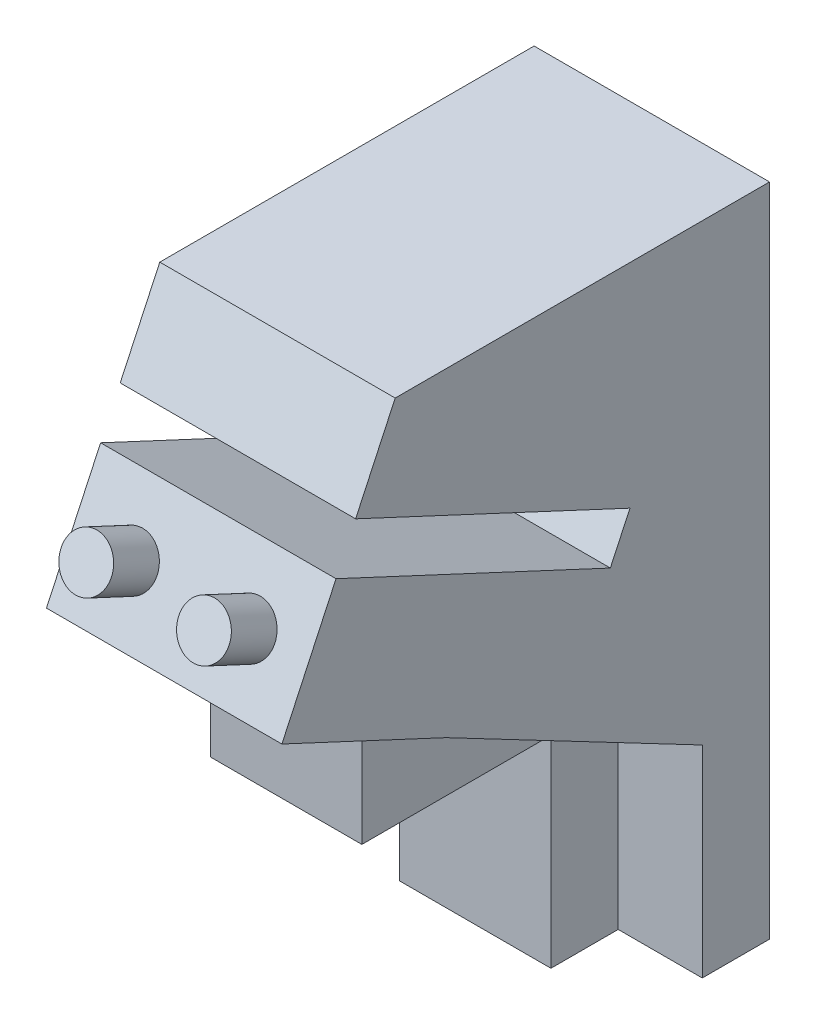
ISO-10303-21;
HEADER;
FILE_DESCRIPTION(('STEP AP214'),'2;1');
FILE_NAME('part.step','',(''),(''),'','','');
FILE_SCHEMA(('AUTOMOTIVE_DESIGN { 1 0 10303 214 1 1 1 1 }'));
ENDSEC;
DATA;
#1=APPLICATION_CONTEXT('core data for automotive mechanical design processes');
#2=APPLICATION_PROTOCOL_DEFINITION('international standard','automotive_design',2000,#1);
#3=PRODUCT_CONTEXT('',#1,'mechanical');
#4=PRODUCT('Part','Part','',(#3));
#5=PRODUCT_RELATED_PRODUCT_CATEGORY('part','',(#4));
#6=PRODUCT_DEFINITION_FORMATION('','',#4);
#7=PRODUCT_DEFINITION_CONTEXT('part definition',#1,'design');
#8=PRODUCT_DEFINITION('design','',#6,#7);
#9=PRODUCT_DEFINITION_SHAPE('','',#8);
#10=(LENGTH_UNIT() NAMED_UNIT(*) SI_UNIT(.MILLI.,.METRE.));
#11=(NAMED_UNIT(*) PLANE_ANGLE_UNIT() SI_UNIT($,.RADIAN.));
#12=(NAMED_UNIT(*) SI_UNIT($,.STERADIAN.) SOLID_ANGLE_UNIT());
#13=UNCERTAINTY_MEASURE_WITH_UNIT(LENGTH_MEASURE(1.E-05),#10,'distance_accuracy_value','');
#14=(GEOMETRIC_REPRESENTATION_CONTEXT(3) GLOBAL_UNCERTAINTY_ASSIGNED_CONTEXT((#13)) GLOBAL_UNIT_ASSIGNED_CONTEXT((#10,
#11,#12)) REPRESENTATION_CONTEXT('',''));
#15=CARTESIAN_POINT('',(0.,0.,0.));
#16=DIRECTION('',(0.,0.,1.));
#17=DIRECTION('',(1.,0.,0.));
#18=AXIS2_PLACEMENT_3D('',#15,#16,#17);
#19=CARTESIAN_POINT('',(28.,0.,0.));
#20=DIRECTION('',(0.,0.,1.));
#21=DIRECTION('',(1.,0.,0.));
#22=AXIS2_PLACEMENT_3D('',#19,#20,#21);
#23=PLANE('',#22);
#24=DIRECTION('',(0.,1.,0.));
#25=VECTOR('',#24,1.);
#26=CARTESIAN_POINT('',(0.,0.,0.));
#27=LINE('',#26,#25);
#28=CARTESIAN_POINT('',(0.,0.,0.));
#29=VERTEX_POINT('',#28);
#30=CARTESIAN_POINT('',(0.,78.,0.));
#31=VERTEX_POINT('',#30);
#32=EDGE_CURVE('E162',#29,#31,#27,.T.);
#33=ORIENTED_EDGE('',*,*,#32,.T.);
#34=DIRECTION('',(-1.,0.,0.));
#35=VECTOR('',#34,1.);
#36=CARTESIAN_POINT('',(28.,78.,0.));
#37=LINE('',#36,#35);
#38=CARTESIAN_POINT('',(28.,78.,0.));
#39=VERTEX_POINT('',#38);
#40=EDGE_CURVE('E46',#39,#31,#37,.T.);
#41=ORIENTED_EDGE('',*,*,#40,.F.);
#42=DIRECTION('',(0.,1.,0.));
#43=VECTOR('',#42,1.);
#44=CARTESIAN_POINT('',(28.,0.,0.));
#45=LINE('',#44,#43);
#46=CARTESIAN_POINT('',(28.,0.,0.));
#47=VERTEX_POINT('',#46);
#48=EDGE_CURVE('E233',#47,#39,#45,.T.);
#49=ORIENTED_EDGE('',*,*,#48,.F.);
#50=DIRECTION('',(-1.,0.,0.));
#51=VECTOR('',#50,1.);
#52=CARTESIAN_POINT('',(28.,0.,0.));
#53=LINE('',#52,#51);
#54=EDGE_CURVE('E11',#47,#29,#53,.T.);
#55=ORIENTED_EDGE('',*,*,#54,.T.);
#56=EDGE_LOOP('',(#33,#41,#49,#55));
#57=FACE_BOUND('',#56,.T.);
#58=ADVANCED_FACE('F39',(#57),#23,.F.);
#59=CARTESIAN_POINT('',(28.,78.,0.));
#60=DIRECTION('',(0.,-1.,0.));
#61=DIRECTION('',(0.,0.,-1.));
#62=AXIS2_PLACEMENT_3D('',#59,#60,#61);
#63=PLANE('',#62);
#64=DIRECTION('',(0.,0.,1.));
#65=VECTOR('',#64,1.);
#66=CARTESIAN_POINT('',(0.,78.,0.));
#67=LINE('',#66,#65);
#68=CARTESIAN_POINT('',(0.,78.,44.5234186246685));
#69=VERTEX_POINT('',#68);
#70=EDGE_CURVE('E164',#31,#69,#67,.T.);
#71=ORIENTED_EDGE('',*,*,#70,.T.);
#72=DIRECTION('',(-1.,0.,0.));
#73=VECTOR('',#72,1.);
#74=CARTESIAN_POINT('',(28.,78.,44.5234186246685));
#75=LINE('',#74,#73);
#76=CARTESIAN_POINT('',(28.,78.,44.5234186246685));
#77=VERTEX_POINT('',#76);
#78=EDGE_CURVE('E206',#77,#69,#75,.T.);
#79=ORIENTED_EDGE('',*,*,#78,.F.);
#80=DIRECTION('',(0.,0.,1.));
#81=VECTOR('',#80,1.);
#82=CARTESIAN_POINT('',(28.,78.,0.));
#83=LINE('',#82,#81);
#84=EDGE_CURVE('E215',#39,#77,#83,.T.);
#85=ORIENTED_EDGE('',*,*,#84,.F.);
#86=ORIENTED_EDGE('',*,*,#40,.T.);
#87=EDGE_LOOP('',(#71,#79,#85,#86));
#88=FACE_BOUND('',#87,.T.);
#89=ADVANCED_FACE('F213',(#88),#63,.F.);
#90=CARTESIAN_POINT('',(28.,78.,44.5234186246685));
#91=DIRECTION('',(0.,-0.422618261740703,-0.906307787036648));
#92=DIRECTION('',(0.,0.906307787036648,-0.422618261740703));
#93=AXIS2_PLACEMENT_3D('',#90,#91,#92);
#94=PLANE('',#93);
#95=DIRECTION('',(0.,-0.906307787036648,0.422618261740703));
#96=VECTOR('',#95,1.);
#97=CARTESIAN_POINT('',(0.,78.,44.5234186246685));
#98=LINE('',#97,#96);
#99=CARTESIAN_POINT('',(0.,67.9092860368489,49.2287958219375));
#100=VERTEX_POINT('',#99);
#101=EDGE_CURVE('E167',#69,#100,#98,.T.);
#102=ORIENTED_EDGE('',*,*,#101,.T.);
#103=DIRECTION('',(-1.,0.,0.));
#104=VECTOR('',#103,1.);
#105=CARTESIAN_POINT('',(28.,67.9092860368489,49.2287958219375));
#106=LINE('',#105,#104);
#107=CARTESIAN_POINT('',(28.,67.9092860368489,49.2287958219375));
#108=VERTEX_POINT('',#107);
#109=EDGE_CURVE('E203',#108,#100,#106,.T.);
#110=ORIENTED_EDGE('',*,*,#109,.F.);
#111=DIRECTION('',(0.,-0.906307787036648,0.422618261740703));
#112=VECTOR('',#111,1.);
#113=CARTESIAN_POINT('',(28.,78.,44.5234186246685));
#114=LINE('',#113,#112);
#115=EDGE_CURVE('E229',#77,#108,#114,.T.);
#116=ORIENTED_EDGE('',*,*,#115,.F.);
#117=ORIENTED_EDGE('',*,*,#78,.T.);
#118=EDGE_LOOP('',(#102,#110,#116,#117));
#119=FACE_BOUND('',#118,.T.);
#120=ADVANCED_FACE('F225',(#119),#94,.F.);
#121=CARTESIAN_POINT('',(28.,52.6950286141837,16.6017154886181));
#122=DIRECTION('',(0.,0.90630778703665,-0.4226182617407));
#123=DIRECTION('',(0.,0.4226182617407,0.90630778703665));
#124=AXIS2_PLACEMENT_3D('',#121,#122,#123);
#125=PLANE('',#124);
#126=DIRECTION('',(0.,-0.4226182617407,-0.90630778703665));
#127=VECTOR('',#126,1.);
#128=CARTESIAN_POINT('',(0.,52.6950286141837,16.6017154886181));
#129=LINE('',#128,#127);
#130=CARTESIAN_POINT('',(0.,52.6950286141837,16.6017154886181));
#131=VERTEX_POINT('',#130);
#132=EDGE_CURVE('E169',#100,#131,#129,.T.);
#133=ORIENTED_EDGE('',*,*,#132,.T.);
#134=DIRECTION('',(-1.,0.,0.));
#135=VECTOR('',#134,1.);
#136=CARTESIAN_POINT('',(28.,52.6950286141837,16.6017154886181));
#137=LINE('',#136,#135);
#138=CARTESIAN_POINT('',(28.,52.6950286141837,16.6017154886181));
#139=VERTEX_POINT('',#138);
#140=EDGE_CURVE('E151',#139,#131,#137,.T.);
#141=ORIENTED_EDGE('',*,*,#140,.F.);
#142=DIRECTION('',(0.,-0.4226182617407,-0.90630778703665));
#143=VECTOR('',#142,1.);
#144=CARTESIAN_POINT('',(28.,52.6950286141837,16.6017154886181));
#145=LINE('',#144,#143);
#146=EDGE_CURVE('E139',#108,#139,#145,.T.);
#147=ORIENTED_EDGE('',*,*,#146,.F.);
#148=ORIENTED_EDGE('',*,*,#109,.T.);
#149=EDGE_LOOP('',(#133,#141,#147,#148));
#150=FACE_BOUND('',#149,.T.);
#151=ADVANCED_FACE('F228',(#150),#125,.F.);
#152=CARTESIAN_POINT('',(28.,47.6950286141837,18.9332537793931));
#153=DIRECTION('',(0.,-0.422618261740699,-0.90630778703665));
#154=DIRECTION('',(0.,0.90630778703665,-0.422618261740699));
#155=AXIS2_PLACEMENT_3D('',#152,#153,#154);
#156=PLANE('',#155);
#157=DIRECTION('',(0.,-0.90630778703665,0.422618261740699));
#158=VECTOR('',#157,1.);
#159=CARTESIAN_POINT('',(0.,47.6950286141837,18.9332537793931));
#160=LINE('',#159,#158);
#161=CARTESIAN_POINT('',(0.,47.6950286141837,18.9332537793931));
#162=VERTEX_POINT('',#161);
#163=EDGE_CURVE('E148',#131,#162,#160,.T.);
#164=ORIENTED_EDGE('',*,*,#163,.T.);
#165=DIRECTION('',(-1.,0.,0.));
#166=VECTOR('',#165,1.);
#167=CARTESIAN_POINT('',(28.,47.6950286141837,18.9332537793931));
#168=LINE('',#167,#166);
#169=CARTESIAN_POINT('',(28.,47.6950286141837,18.9332537793931));
#170=VERTEX_POINT('',#169);
#171=EDGE_CURVE('E145',#170,#162,#168,.T.);
#172=ORIENTED_EDGE('',*,*,#171,.F.);
#173=DIRECTION('',(0.,-0.90630778703665,0.422618261740699));
#174=VECTOR('',#173,1.);
#175=CARTESIAN_POINT('',(28.,47.6950286141837,18.9332537793931));
#176=LINE('',#175,#174);
#177=EDGE_CURVE('E131',#139,#170,#176,.T.);
#178=ORIENTED_EDGE('',*,*,#177,.F.);
#179=ORIENTED_EDGE('',*,*,#140,.T.);
#180=EDGE_LOOP('',(#164,#172,#178,#179));
#181=FACE_BOUND('',#180,.T.);
#182=ADVANCED_FACE('F146',(#181),#156,.F.);
#183=CARTESIAN_POINT('',(28.,62.9092860368489,51.5603341127125));
#184=DIRECTION('',(0.,-0.90630778703665,0.4226182617407));
#185=DIRECTION('',(0.,-0.4226182617407,-0.90630778703665));
#186=AXIS2_PLACEMENT_3D('',#183,#184,#185);
#187=PLANE('',#186);
#188=DIRECTION('',(0.,0.4226182617407,0.90630778703665));
#189=VECTOR('',#188,1.);
#190=CARTESIAN_POINT('',(0.,62.9092860368489,51.5603341127125));
#191=LINE('',#190,#189);
#192=CARTESIAN_POINT('',(0.,62.9092860368489,51.5603341127125));
#193=VERTEX_POINT('',#192);
#194=EDGE_CURVE('E172',#162,#193,#191,.T.);
#195=ORIENTED_EDGE('',*,*,#194,.T.);
#196=DIRECTION('',(-1.,0.,0.));
#197=VECTOR('',#196,1.);
#198=CARTESIAN_POINT('',(28.,62.9092860368489,51.5603341127125));
#199=LINE('',#198,#197);
#200=CARTESIAN_POINT('',(28.,62.9092860368489,51.5603341127125));
#201=VERTEX_POINT('',#200);
#202=EDGE_CURVE('E152',#201,#193,#199,.T.);
#203=ORIENTED_EDGE('',*,*,#202,.F.);
#204=DIRECTION('',(0.,0.4226182617407,0.90630778703665));
#205=VECTOR('',#204,1.);
#206=CARTESIAN_POINT('',(28.,62.9092860368489,51.5603341127125));
#207=LINE('',#206,#205);
#208=EDGE_CURVE('E136',#170,#201,#207,.T.);
#209=ORIENTED_EDGE('',*,*,#208,.F.);
#210=ORIENTED_EDGE('',*,*,#171,.T.);
#211=EDGE_LOOP('',(#195,#203,#209,#210));
#212=FACE_BOUND('',#211,.T.);
#213=ADVANCED_FACE('F154',(#212),#187,.F.);
#214=CARTESIAN_POINT('',(28.,49.0993779757915,58.));
#215=DIRECTION('',(0.,-0.4226182617407,-0.90630778703665));
#216=DIRECTION('',(0.,0.90630778703665,-0.4226182617407));
#217=AXIS2_PLACEMENT_3D('',#214,#215,#216);
#218=PLANE('',#217);
#219=CARTESIAN_POINT('',(7.,55.8966863785599,54.8303630370128));
#220=DIRECTION('',(0.,-0.4226182617407,-0.90630778703665));
#221=DIRECTION('',(0.,0.90630778703665,-0.4226182617407));
#222=AXIS2_PLACEMENT_3D('',#219,#220,#221);
#223=CIRCLE('',#222,3.);
#224=CARTESIAN_POINT('',(7.,58.6156097396699,53.5625082517907));
#225=VERTEX_POINT('',#224);
#226=EDGE_CURVE('E268',#225,#225,#223,.T.);
#227=ORIENTED_EDGE('',*,*,#226,.T.);
#228=EDGE_LOOP('',(#227));
#229=FACE_BOUND('',#228,.T.);
#230=CARTESIAN_POINT('',(21.,55.8966863785599,54.8303630370128));
#231=DIRECTION('',(0.,-0.4226182617407,-0.90630778703665));
#232=DIRECTION('',(0.,0.90630778703665,-0.4226182617407));
#233=AXIS2_PLACEMENT_3D('',#230,#231,#232);
#234=CIRCLE('',#233,3.00000000000001);
#235=CARTESIAN_POINT('',(21.,58.6156097396699,53.5625082517907));
#236=VERTEX_POINT('',#235);
#237=EDGE_CURVE('E265',#236,#236,#234,.T.);
#238=ORIENTED_EDGE('',*,*,#237,.T.);
#239=EDGE_LOOP('',(#238));
#240=FACE_BOUND('',#239,.T.);
#241=DIRECTION('',(0.,-0.90630778703665,0.4226182617407));
#242=VECTOR('',#241,1.);
#243=CARTESIAN_POINT('',(0.,49.0993779757915,58.));
#244=LINE('',#243,#242);
#245=CARTESIAN_POINT('',(0.,49.0993779757915,58.));
#246=VERTEX_POINT('',#245);
#247=EDGE_CURVE('E174',#193,#246,#244,.T.);
#248=ORIENTED_EDGE('',*,*,#247,.T.);
#249=DIRECTION('',(-1.,0.,0.));
#250=VECTOR('',#249,1.);
#251=CARTESIAN_POINT('',(28.,49.0993779757915,58.));
#252=LINE('',#251,#250);
#253=CARTESIAN_POINT('',(28.,49.0993779757915,58.));
#254=VERTEX_POINT('',#253);
#255=EDGE_CURVE('E198',#254,#246,#252,.T.);
#256=ORIENTED_EDGE('',*,*,#255,.F.);
#257=DIRECTION('',(0.,-0.90630778703665,0.4226182617407));
#258=VECTOR('',#257,1.);
#259=CARTESIAN_POINT('',(28.,49.0993779757915,58.));
#260=LINE('',#259,#258);
#261=EDGE_CURVE('E62',#201,#254,#260,.T.);
#262=ORIENTED_EDGE('',*,*,#261,.F.);
#263=ORIENTED_EDGE('',*,*,#202,.T.);
#264=EDGE_LOOP('',(#248,#256,#262,#263));
#265=FACE_BOUND('',#264,.T.);
#266=ADVANCED_FACE('F318',(#229,#240,#265),#218,.F.);
#267=CARTESIAN_POINT('',(28.,40.,38.4863209585827));
#268=DIRECTION('',(0.,0.906307787036651,-0.422618261740697));
#269=DIRECTION('',(0.,0.422618261740697,0.906307787036651));
#270=AXIS2_PLACEMENT_3D('',#267,#268,#269);
#271=PLANE('',#270);
#272=DIRECTION('',(0.,-0.422618261740697,-0.906307787036651));
#273=VECTOR('',#272,1.);
#274=CARTESIAN_POINT('',(0.,40.,38.4863209585827));
#275=LINE('',#274,#273);
#276=CARTESIAN_POINT('',(0.,40.,38.4863209585827));
#277=VERTEX_POINT('',#276);
#278=EDGE_CURVE('E176',#246,#277,#275,.T.);
#279=ORIENTED_EDGE('',*,*,#278,.T.);
#280=DIRECTION('',(-1.,0.,0.));
#281=VECTOR('',#280,1.);
#282=CARTESIAN_POINT('',(28.,40.,38.4863209585827));
#283=LINE('',#282,#281);
#284=CARTESIAN_POINT('',(18.,40.,38.4863209585827));
#285=VERTEX_POINT('',#284);
#286=EDGE_CURVE('E194',#285,#277,#283,.T.);
#287=ORIENTED_EDGE('',*,*,#286,.F.);
#288=CARTESIAN_POINT('',(28.,40.,38.4863209585827));
#289=VERTEX_POINT('',#288);
#290=EDGE_CURVE('E195',#289,#285,#283,.T.);
#291=ORIENTED_EDGE('',*,*,#290,.F.);
#292=DIRECTION('',(0.,-0.422618261740697,-0.906307787036651));
#293=VECTOR('',#292,1.);
#294=CARTESIAN_POINT('',(28.,40.,38.4863209585827));
#295=LINE('',#294,#293);
#296=EDGE_CURVE('E157',#254,#289,#295,.T.);
#297=ORIENTED_EDGE('',*,*,#296,.F.);
#298=ORIENTED_EDGE('',*,*,#255,.T.);
#299=EDGE_LOOP('',(#279,#287,#291,#297,#298));
#300=FACE_BOUND('',#299,.T.);
#301=ADVANCED_FACE('F313',(#300),#271,.F.);
#302=CARTESIAN_POINT('',(28.,24.,38.4863209585827));
#303=DIRECTION('',(0.,0.,-1.));
#304=DIRECTION('',(-1.,0.,0.));
#305=AXIS2_PLACEMENT_3D('',#302,#303,#304);
#306=PLANE('',#305);
#307=DIRECTION('',(-1.,0.,0.));
#308=VECTOR('',#307,1.);
#309=CARTESIAN_POINT('',(28.,24.,38.4863209585827));
#310=LINE('',#309,#308);
#311=CARTESIAN_POINT('',(18.,24.,38.4863209585827));
#312=VERTEX_POINT('',#311);
#313=CARTESIAN_POINT('',(0.,24.,38.4863209585827));
#314=VERTEX_POINT('',#313);
#315=EDGE_CURVE('E192',#312,#314,#310,.T.);
#316=ORIENTED_EDGE('',*,*,#315,.F.);
#317=DIRECTION('',(0.,-1.,0.));
#318=VECTOR('',#317,1.);
#319=CARTESIAN_POINT('',(18.,0.,38.4863209585827));
#320=LINE('',#319,#318);
#321=EDGE_CURVE('E254',#285,#312,#320,.T.);
#322=ORIENTED_EDGE('',*,*,#321,.F.);
#323=ORIENTED_EDGE('',*,*,#286,.T.);
#324=DIRECTION('',(0.,-1.,0.));
#325=VECTOR('',#324,1.);
#326=CARTESIAN_POINT('',(0.,24.,38.4863209585827));
#327=LINE('',#326,#325);
#328=EDGE_CURVE('E179',#277,#314,#327,.T.);
#329=ORIENTED_EDGE('',*,*,#328,.T.);
#330=EDGE_LOOP('',(#316,#322,#323,#329));
#331=FACE_BOUND('',#330,.T.);
#332=ADVANCED_FACE('F308',(#331),#306,.F.);
#333=CARTESIAN_POINT('',(28.,24.,16.));
#334=DIRECTION('',(0.,1.,0.));
#335=DIRECTION('',(0.,0.,1.));
#336=AXIS2_PLACEMENT_3D('',#333,#334,#335);
#337=PLANE('',#336);
#338=DIRECTION('',(-1.,0.,0.));
#339=VECTOR('',#338,1.);
#340=CARTESIAN_POINT('',(28.,24.,16.));
#341=LINE('',#340,#339);
#342=CARTESIAN_POINT('',(18.,24.,16.));
#343=VERTEX_POINT('',#342);
#344=CARTESIAN_POINT('',(0.,24.,16.));
#345=VERTEX_POINT('',#344);
#346=EDGE_CURVE('E190',#343,#345,#341,.T.);
#347=ORIENTED_EDGE('',*,*,#346,.F.);
#348=DIRECTION('',(0.,0.,-1.));
#349=VECTOR('',#348,1.);
#350=CARTESIAN_POINT('',(18.,24.,0.));
#351=LINE('',#350,#349);
#352=EDGE_CURVE('E251',#312,#343,#351,.T.);
#353=ORIENTED_EDGE('',*,*,#352,.F.);
#354=ORIENTED_EDGE('',*,*,#315,.T.);
#355=DIRECTION('',(0.,0.,-1.));
#356=VECTOR('',#355,1.);
#357=CARTESIAN_POINT('',(0.,24.,16.));
#358=LINE('',#357,#356);
#359=EDGE_CURVE('E182',#314,#345,#358,.T.);
#360=ORIENTED_EDGE('',*,*,#359,.T.);
#361=EDGE_LOOP('',(#347,#353,#354,#360));
#362=FACE_BOUND('',#361,.T.);
#363=ADVANCED_FACE('F303',(#362),#337,.F.);
#364=CARTESIAN_POINT('',(28.,0.,16.));
#365=DIRECTION('',(0.,0.,-1.));
#366=DIRECTION('',(-1.,0.,0.));
#367=AXIS2_PLACEMENT_3D('',#364,#365,#366);
#368=PLANE('',#367);
#369=DIRECTION('',(-1.,0.,0.));
#370=VECTOR('',#369,1.);
#371=CARTESIAN_POINT('',(28.,0.,16.));
#372=LINE('',#371,#370);
#373=CARTESIAN_POINT('',(18.,0.,16.));
#374=VERTEX_POINT('',#373);
#375=CARTESIAN_POINT('',(0.,0.,16.));
#376=VERTEX_POINT('',#375);
#377=EDGE_CURVE('E107',#374,#376,#372,.T.);
#378=ORIENTED_EDGE('',*,*,#377,.F.);
#379=DIRECTION('',(0.,-1.,0.));
#380=VECTOR('',#379,1.);
#381=CARTESIAN_POINT('',(18.,0.,16.));
#382=LINE('',#381,#380);
#383=EDGE_CURVE('E248',#343,#374,#382,.T.);
#384=ORIENTED_EDGE('',*,*,#383,.F.);
#385=ORIENTED_EDGE('',*,*,#346,.T.);
#386=DIRECTION('',(0.,-1.,0.));
#387=VECTOR('',#386,1.);
#388=CARTESIAN_POINT('',(0.,0.,16.));
#389=LINE('',#388,#387);
#390=EDGE_CURVE('E185',#345,#376,#389,.T.);
#391=ORIENTED_EDGE('',*,*,#390,.T.);
#392=EDGE_LOOP('',(#378,#384,#385,#391));
#393=FACE_BOUND('',#392,.T.);
#394=ADVANCED_FACE('F296',(#393),#368,.F.);
#395=CARTESIAN_POINT('',(28.,0.,8.));
#396=DIRECTION('',(0.,1.,0.));
#397=DIRECTION('',(0.,0.,1.));
#398=AXIS2_PLACEMENT_3D('',#395,#396,#397);
#399=PLANE('',#398);
#400=DIRECTION('',(0.,0.,-1.));
#401=VECTOR('',#400,1.);
#402=CARTESIAN_POINT('',(28.,0.,0.));
#403=LINE('',#402,#401);
#404=CARTESIAN_POINT('',(28.,0.,8.));
#405=VERTEX_POINT('',#404);
#406=EDGE_CURVE('E114',#405,#47,#403,.T.);
#407=ORIENTED_EDGE('',*,*,#406,.F.);
#408=DIRECTION('',(1.,0.,0.));
#409=VECTOR('',#408,1.);
#410=CARTESIAN_POINT('',(18.,0.,8.));
#411=LINE('',#410,#409);
#412=CARTESIAN_POINT('',(18.,0.,8.));
#413=VERTEX_POINT('',#412);
#414=EDGE_CURVE('E165',#413,#405,#411,.T.);
#415=ORIENTED_EDGE('',*,*,#414,.F.);
#416=DIRECTION('',(0.,0.,-1.));
#417=VECTOR('',#416,1.);
#418=CARTESIAN_POINT('',(18.,0.,0.));
#419=LINE('',#418,#417);
#420=EDGE_CURVE('E238',#374,#413,#419,.T.);
#421=ORIENTED_EDGE('',*,*,#420,.F.);
#422=ORIENTED_EDGE('',*,*,#377,.T.);
#423=DIRECTION('',(0.,0.,-1.));
#424=VECTOR('',#423,1.);
#425=CARTESIAN_POINT('',(0.,0.,8.));
#426=LINE('',#425,#424);
#427=EDGE_CURVE('E187',#376,#29,#426,.T.);
#428=ORIENTED_EDGE('',*,*,#427,.T.);
#429=ORIENTED_EDGE('',*,*,#54,.F.);
#430=EDGE_LOOP('',(#407,#415,#421,#422,#428,#429));
#431=FACE_BOUND('',#430,.T.);
#432=ADVANCED_FACE('F290',(#431),#399,.F.);
#433=CARTESIAN_POINT('',(28.,0.,0.));
#434=DIRECTION('',(-1.,0.,0.));
#435=DIRECTION('',(0.,0.,1.));
#436=AXIS2_PLACEMENT_3D('',#433,#434,#435);
#437=PLANE('',#436);
#438=DIRECTION('',(0.,0.464712798290951,0.885461470141188));
#439=VECTOR('',#438,1.);
#440=CARTESIAN_POINT('',(28.,15.5251261419652,-8.14798278247189));
#441=LINE('',#440,#439);
#442=CARTESIAN_POINT('',(28.,24.,8.));
#443=VERTEX_POINT('',#442);
#444=EDGE_CURVE('E240',#443,#289,#441,.T.);
#445=ORIENTED_EDGE('',*,*,#444,.F.);
#446=DIRECTION('',(0.,1.,0.));
#447=VECTOR('',#446,1.);
#448=CARTESIAN_POINT('',(28.,0.,8.));
#449=LINE('',#448,#447);
#450=EDGE_CURVE('E53',#405,#443,#449,.T.);
#451=ORIENTED_EDGE('',*,*,#450,.F.);
#452=ORIENTED_EDGE('',*,*,#406,.T.);
#453=ORIENTED_EDGE('',*,*,#48,.T.);
#454=ORIENTED_EDGE('',*,*,#84,.T.);
#455=ORIENTED_EDGE('',*,*,#115,.T.);
#456=ORIENTED_EDGE('',*,*,#146,.T.);
#457=ORIENTED_EDGE('',*,*,#177,.T.);
#458=ORIENTED_EDGE('',*,*,#208,.T.);
#459=ORIENTED_EDGE('',*,*,#261,.T.);
#460=ORIENTED_EDGE('',*,*,#296,.T.);
#461=EDGE_LOOP('',(#445,#451,#452,#453,#454,#455,#456,#457,#458,#459,#460));
#462=FACE_BOUND('',#461,.T.);
#463=ADVANCED_FACE('F134',(#462),#437,.F.);
#464=CARTESIAN_POINT('',(0.,0.,0.));
#465=DIRECTION('',(-1.,0.,0.));
#466=DIRECTION('',(0.,0.,1.));
#467=AXIS2_PLACEMENT_3D('',#464,#465,#466);
#468=PLANE('',#467);
#469=ORIENTED_EDGE('',*,*,#32,.F.);
#470=ORIENTED_EDGE('',*,*,#427,.F.);
#471=ORIENTED_EDGE('',*,*,#390,.F.);
#472=ORIENTED_EDGE('',*,*,#359,.F.);
#473=ORIENTED_EDGE('',*,*,#328,.F.);
#474=ORIENTED_EDGE('',*,*,#278,.F.);
#475=ORIENTED_EDGE('',*,*,#247,.F.);
#476=ORIENTED_EDGE('',*,*,#194,.F.);
#477=ORIENTED_EDGE('',*,*,#163,.F.);
#478=ORIENTED_EDGE('',*,*,#132,.F.);
#479=ORIENTED_EDGE('',*,*,#101,.F.);
#480=ORIENTED_EDGE('',*,*,#70,.F.);
#481=EDGE_LOOP('',(#469,#470,#471,#472,#473,#474,#475,#476,#477,#478,#479,#480));
#482=FACE_BOUND('',#481,.T.);
#483=ADVANCED_FACE('F220',(#482),#468,.T.);
#484=CARTESIAN_POINT('',(18.,0.,8.));
#485=DIRECTION('',(0.,0.,-1.));
#486=DIRECTION('',(-1.,0.,0.));
#487=AXIS2_PLACEMENT_3D('',#484,#485,#486);
#488=PLANE('',#487);
#489=ORIENTED_EDGE('',*,*,#450,.T.);
#490=DIRECTION('',(1.,0.,0.));
#491=VECTOR('',#490,1.);
#492=CARTESIAN_POINT('',(18.,24.,8.));
#493=LINE('',#492,#491);
#494=CARTESIAN_POINT('',(18.,24.,8.));
#495=VERTEX_POINT('',#494);
#496=EDGE_CURVE('E236',#495,#443,#493,.T.);
#497=ORIENTED_EDGE('',*,*,#496,.F.);
#498=DIRECTION('',(0.,1.,0.));
#499=VECTOR('',#498,1.);
#500=CARTESIAN_POINT('',(18.,0.,8.));
#501=LINE('',#500,#499);
#502=EDGE_CURVE('E243',#413,#495,#501,.T.);
#503=ORIENTED_EDGE('',*,*,#502,.F.);
#504=ORIENTED_EDGE('',*,*,#414,.T.);
#505=EDGE_LOOP('',(#489,#497,#503,#504));
#506=FACE_BOUND('',#505,.T.);
#507=ADVANCED_FACE('F363',(#506),#488,.F.);
#508=CARTESIAN_POINT('',(18.,15.5251261419652,-8.14798278247189));
#509=DIRECTION('',(0.,0.885461470141188,-0.46471279829095));
#510=DIRECTION('',(0.,0.46471279829095,0.885461470141188));
#511=AXIS2_PLACEMENT_3D('',#508,#509,#510);
#512=PLANE('',#511);
#513=ORIENTED_EDGE('',*,*,#444,.T.);
#514=ORIENTED_EDGE('',*,*,#290,.T.);
#515=DIRECTION('',(0.,0.464712798290951,0.885461470141188));
#516=VECTOR('',#515,1.);
#517=CARTESIAN_POINT('',(18.,15.5251261419652,-8.14798278247189));
#518=LINE('',#517,#516);
#519=EDGE_CURVE('E257',#495,#285,#518,.T.);
#520=ORIENTED_EDGE('',*,*,#519,.F.);
#521=ORIENTED_EDGE('',*,*,#496,.T.);
#522=EDGE_LOOP('',(#513,#514,#520,#521));
#523=FACE_BOUND('',#522,.T.);
#524=ADVANCED_FACE('F411',(#523),#512,.F.);
#525=CARTESIAN_POINT('',(18.,0.,0.));
#526=DIRECTION('',(-1.,0.,0.));
#527=DIRECTION('',(0.,0.,1.));
#528=AXIS2_PLACEMENT_3D('',#525,#526,#527);
#529=PLANE('',#528);
#530=ORIENTED_EDGE('',*,*,#502,.T.);
#531=ORIENTED_EDGE('',*,*,#519,.T.);
#532=ORIENTED_EDGE('',*,*,#321,.T.);
#533=ORIENTED_EDGE('',*,*,#352,.T.);
#534=ORIENTED_EDGE('',*,*,#383,.T.);
#535=ORIENTED_EDGE('',*,*,#420,.T.);
#536=EDGE_LOOP('',(#530,#531,#532,#533,#534,#535));
#537=FACE_BOUND('',#536,.T.);
#538=ADVANCED_FACE('F418',(#537),#529,.F.);
#539=CARTESIAN_POINT('',(21.,58.4323959490041,60.2682097592327));
#540=DIRECTION('',(0.,-0.4226182617407,-0.906307787036649));
#541=DIRECTION('',(0.,0.906307787036649,-0.4226182617407));
#542=AXIS2_PLACEMENT_3D('',#539,#540,#541);
#543=CYLINDRICAL_SURFACE('',#542,3.00000000000001);
#544=CARTESIAN_POINT('',(21.,58.4323959490041,60.2682097592327));
#545=DIRECTION('',(0.,-0.4226182617407,-0.90630778703665));
#546=DIRECTION('',(0.,0.90630778703665,-0.4226182617407));
#547=AXIS2_PLACEMENT_3D('',#544,#545,#546);
#548=CIRCLE('',#547,3.00000000000001);
#549=CARTESIAN_POINT('',(21.,61.1513193101141,59.0003549740106));
#550=VERTEX_POINT('',#549);
#551=EDGE_CURVE('E262',#550,#550,#548,.T.);
#552=ORIENTED_EDGE('',*,*,#551,.T.);
#553=EDGE_LOOP('',(#552));
#554=FACE_BOUND('',#553,.T.);
#555=ORIENTED_EDGE('',*,*,#237,.F.);
#556=EDGE_LOOP('',(#555));
#557=FACE_BOUND('',#556,.T.);
#558=ADVANCED_FACE('F426',(#554,#557),#543,.T.);
#559=CARTESIAN_POINT('',(21.,58.4323959490041,60.2682097592327));
#560=DIRECTION('',(0.,-0.4226182617407,-0.90630778703665));
#561=DIRECTION('',(0.,0.90630778703665,-0.4226182617407));
#562=AXIS2_PLACEMENT_3D('',#559,#560,#561);
#563=PLANE('',#562);
#564=ORIENTED_EDGE('',*,*,#551,.F.);
#565=EDGE_LOOP('',(#564));
#566=FACE_BOUND('',#565,.T.);
#567=ADVANCED_FACE('F283',(#566),#563,.F.);
#568=CARTESIAN_POINT('',(7.,58.4323959490041,60.2682097592327));
#569=DIRECTION('',(0.,-0.4226182617407,-0.906307787036649));
#570=DIRECTION('',(0.,0.906307787036649,-0.4226182617407));
#571=AXIS2_PLACEMENT_3D('',#568,#569,#570);
#572=CYLINDRICAL_SURFACE('',#571,3.);
#573=CARTESIAN_POINT('',(7.,58.4323959490041,60.2682097592327));
#574=DIRECTION('',(0.,-0.4226182617407,-0.90630778703665));
#575=DIRECTION('',(0.,0.90630778703665,-0.4226182617407));
#576=AXIS2_PLACEMENT_3D('',#573,#574,#575);
#577=CIRCLE('',#576,3.);
#578=CARTESIAN_POINT('',(7.,61.1513193101141,59.0003549740106));
#579=VERTEX_POINT('',#578);
#580=EDGE_CURVE('E245',#579,#579,#577,.T.);
#581=ORIENTED_EDGE('',*,*,#580,.T.);
#582=EDGE_LOOP('',(#581));
#583=FACE_BOUND('',#582,.T.);
#584=ORIENTED_EDGE('',*,*,#226,.F.);
#585=EDGE_LOOP('',(#584));
#586=FACE_BOUND('',#585,.T.);
#587=ADVANCED_FACE('F274',(#583,#586),#572,.T.);
#588=CARTESIAN_POINT('',(7.,58.4323959490041,60.2682097592327));
#589=DIRECTION('',(0.,-0.4226182617407,-0.90630778703665));
#590=DIRECTION('',(0.,0.90630778703665,-0.4226182617407));
#591=AXIS2_PLACEMENT_3D('',#588,#589,#590);
#592=PLANE('',#591);
#593=ORIENTED_EDGE('',*,*,#580,.F.);
#594=EDGE_LOOP('',(#593));
#595=FACE_BOUND('',#594,.T.);
#596=ADVANCED_FACE('F277',(#595),#592,.F.);
#597=CLOSED_SHELL('',(#58,#89,#120,#151,#182,#213,#266,#301,#332,#363,#394,#432,#463,#483,#507,
#524,#538,#558,#567,#587,#596));
#598=MANIFOLD_SOLID_BREP('B2',#597);
#599=ADVANCED_BREP_SHAPE_REPRESENTATION('',(#18,#598),#14);
#600=SHAPE_DEFINITION_REPRESENTATION(#9,#599);
ENDSEC;
END-ISO-10303-21;
